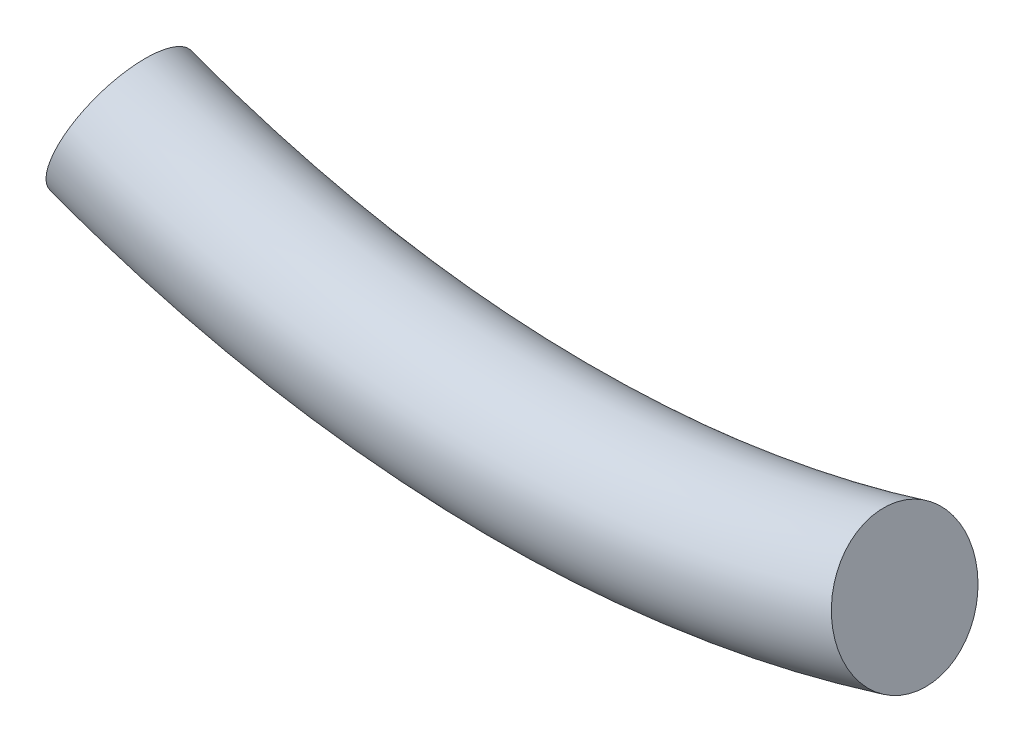
ISO-10303-21;
HEADER;
FILE_DESCRIPTION(('STEP AP214'),'2;1');
FILE_NAME('part.step','',(''),(''),'','','');
FILE_SCHEMA(('AUTOMOTIVE_DESIGN { 1 0 10303 214 1 1 1 1 }'));
ENDSEC;
DATA;
#1=APPLICATION_CONTEXT('core data for automotive mechanical design processes');
#2=APPLICATION_PROTOCOL_DEFINITION('international standard','automotive_design',2000,#1);
#3=PRODUCT_CONTEXT('',#1,'mechanical');
#4=PRODUCT('Part','Part','',(#3));
#5=PRODUCT_RELATED_PRODUCT_CATEGORY('part','',(#4));
#6=PRODUCT_DEFINITION_FORMATION('','',#4);
#7=PRODUCT_DEFINITION_CONTEXT('part definition',#1,'design');
#8=PRODUCT_DEFINITION('design','',#6,#7);
#9=PRODUCT_DEFINITION_SHAPE('','',#8);
#10=(LENGTH_UNIT() NAMED_UNIT(*) SI_UNIT(.MILLI.,.METRE.));
#11=(NAMED_UNIT(*) PLANE_ANGLE_UNIT() SI_UNIT($,.RADIAN.));
#12=(NAMED_UNIT(*) SI_UNIT($,.STERADIAN.) SOLID_ANGLE_UNIT());
#13=UNCERTAINTY_MEASURE_WITH_UNIT(LENGTH_MEASURE(1.E-05),#10,'distance_accuracy_value','');
#14=(GEOMETRIC_REPRESENTATION_CONTEXT(3) GLOBAL_UNCERTAINTY_ASSIGNED_CONTEXT((#13)) GLOBAL_UNIT_ASSIGNED_CONTEXT((#10,
#11,#12)) REPRESENTATION_CONTEXT('',''));
#15=CARTESIAN_POINT('',(0.,0.,0.));
#16=DIRECTION('',(0.,0.,1.));
#17=DIRECTION('',(1.,0.,0.));
#18=AXIS2_PLACEMENT_3D('',#15,#16,#17);
#19=CARTESIAN_POINT('',(0.,0.,-101.5));
#20=DIRECTION('',(-0.953915915523171,-0.300074034384166,0.));
#21=DIRECTION('',(0.300074034384166,-0.953915915523171,0.));
#22=AXIS2_PLACEMENT_3D('',#19,#20,#21);
#23=PLANE('',#22);
#24=CARTESIAN_POINT('',(2.17919039685501,-6.92750509647217,-106.7698));
#25=CARTESIAN_POINT('',(2.17918984301487,-6.92750333585026,-106.74734475844));
#26=CARTESIAN_POINT('',(2.17862090205532,-6.9256947093977,-106.724869142741));
#27=CARTESIAN_POINT('',(2.17635747025083,-6.91849940632381,-106.680517548703));
#28=CARTESIAN_POINT('',(2.17466057047544,-6.91310507186858,-106.658642958289));
#29=CARTESIAN_POINT('',(2.17019177517683,-6.89889906111759,-106.616190381653));
#30=CARTESIAN_POINT('',(2.16742179833214,-6.89009348417653,-106.595610156997));
#31=CARTESIAN_POINT('',(2.16088034121122,-6.86929861576626,-106.556262662778));
#32=CARTESIAN_POINT('',(2.15710744019032,-6.85730480784178,-106.53749801701));
#33=CARTESIAN_POINT('',(2.14867526757211,-6.83049947735242,-106.502372515062));
#34=CARTESIAN_POINT('',(2.14401725331382,-6.8156919517868,-106.486008306697));
#35=CARTESIAN_POINT('',(2.13393632125499,-6.78364532184776,-106.456095115093));
#36=CARTESIAN_POINT('',(2.12851234179326,-6.76640284252216,-106.442550104961));
#37=CARTESIAN_POINT('',(2.11706283042356,-6.73000558761492,-106.418698058126));
#38=CARTESIAN_POINT('',(2.11103773953943,-6.7108522140195,-106.4083886702));
#39=CARTESIAN_POINT('',(2.09855334150362,-6.6711651214441,-106.391286516976));
#40=CARTESIAN_POINT('',(2.09209400883193,-6.65063132133763,-106.384493958563));
#41=CARTESIAN_POINT('',(2.07892501973082,-6.60876795811568,-106.374619387071));
#42=CARTESIAN_POINT('',(2.07221537066865,-6.58743841842019,-106.371537264876));
#43=CARTESIAN_POINT('',(2.05873603454983,-6.54458848213424,-106.369170683823));
#44=CARTESIAN_POINT('',(2.05196634749318,-6.52306808554377,-106.369886224964));
#45=CARTESIAN_POINT('',(2.03855890687865,-6.48044670040835,-106.375094745066));
#46=CARTESIAN_POINT('',(2.03192115720672,-6.45934572421657,-106.379587835118));
#47=CARTESIAN_POINT('',(2.0189666258938,-6.41816410840998,-106.392223649074));
#48=CARTESIAN_POINT('',(2.01264982539734,-6.39808340885488,-106.400366158301));
#49=CARTESIAN_POINT('',(2.00051162170426,-6.35949684566737,-106.420076885485));
#50=CARTESIAN_POINT('',(1.99469058295391,-6.34099214058608,-106.431647596081));
#51=CARTESIAN_POINT('',(1.98372226908321,-6.30612458135462,-106.457865149698));
#52=CARTESIAN_POINT('',(1.97857406345444,-6.28975876917847,-106.472507669844));
#53=CARTESIAN_POINT('',(1.96908103297131,-6.25958104026238,-106.504486025252));
#54=CARTESIAN_POINT('',(1.96473735279823,-6.24577276239007,-106.521825634422));
#55=CARTESIAN_POINT('',(1.95699144790232,-6.22114903253118,-106.558664681642));
#56=CARTESIAN_POINT('',(1.95358789303048,-6.2103293520871,-106.578161012918));
#57=CARTESIAN_POINT('',(1.94780526994693,-6.19194676792184,-106.618813737375));
#58=CARTESIAN_POINT('',(1.94542803921235,-6.18438970542145,-106.63997302846));
#59=CARTESIAN_POINT('',(1.94177869326649,-6.17278867107623,-106.683286509964));
#60=CARTESIAN_POINT('',(1.94050422622284,-6.16873722290864,-106.705438476605));
#61=CARTESIAN_POINT('',(1.93935264029228,-6.16507640583892,-106.741730237853));
#62=CARTESIAN_POINT('',(1.93913082309063,-6.1643712633249,-106.755761137143));
#63=CARTESIAN_POINT('',(1.93913172318781,-6.16437412467554,-106.79225524156));
#64=CARTESIAN_POINT('',(1.93970066414737,-6.1661827511281,-106.814730857259));
#65=CARTESIAN_POINT('',(1.94196409595185,-6.17337805420199,-106.859082451298));
#66=CARTESIAN_POINT('',(1.94366099572725,-6.17877238865722,-106.880957041711));
#67=CARTESIAN_POINT('',(1.94812979102586,-6.19297839940822,-106.923409618347));
#68=CARTESIAN_POINT('',(1.95089976787055,-6.20178397634928,-106.943989843003));
#69=CARTESIAN_POINT('',(1.95744122499147,-6.22257884475956,-106.983337337222));
#70=CARTESIAN_POINT('',(1.96121412601237,-6.23457265268404,-107.00210198299));
#71=CARTESIAN_POINT('',(1.96964629863058,-6.26137798317341,-107.037227484938));
#72=CARTESIAN_POINT('',(1.97430431288887,-6.27618550873902,-107.053591693303));
#73=CARTESIAN_POINT('',(1.9843852449477,-6.30823213867807,-107.083504884907));
#74=CARTESIAN_POINT('',(1.98980922440943,-6.32547461800367,-107.097049895039));
#75=CARTESIAN_POINT('',(2.00125873577914,-6.36187187291091,-107.120901941874));
#76=CARTESIAN_POINT('',(2.00728382666327,-6.38102524650633,-107.1312113298));
#77=CARTESIAN_POINT('',(2.01976822469907,-6.42071233908173,-107.148313483024));
#78=CARTESIAN_POINT('',(2.02622755737077,-6.4412461391882,-107.155106041438));
#79=CARTESIAN_POINT('',(2.03939654647188,-6.48310950241016,-107.164980612929));
#80=CARTESIAN_POINT('',(2.04610619553405,-6.50443904210564,-107.168062735124));
#81=CARTESIAN_POINT('',(2.05958553165287,-6.54728897839159,-107.170429316177));
#82=CARTESIAN_POINT('',(2.06635521870952,-6.56880937498206,-107.169713775036));
#83=CARTESIAN_POINT('',(2.07976265932404,-6.61143076011748,-107.164505254934));
#84=CARTESIAN_POINT('',(2.08640040899597,-6.63253173630926,-107.160012164882));
#85=CARTESIAN_POINT('',(2.0993549403089,-6.67371335211585,-107.147376350926));
#86=CARTESIAN_POINT('',(2.10567174080536,-6.69379405167095,-107.139233841699));
#87=CARTESIAN_POINT('',(2.11780994449844,-6.73238061485846,-107.119523114515));
#88=CARTESIAN_POINT('',(2.12363098324878,-6.75088531993975,-107.107952403919));
#89=CARTESIAN_POINT('',(2.13459929711948,-6.78575287917122,-107.081734850302));
#90=CARTESIAN_POINT('',(2.13974750274825,-6.80211869134737,-107.067092330157));
#91=CARTESIAN_POINT('',(2.14924053323138,-6.83229642026345,-107.035113974748));
#92=CARTESIAN_POINT('',(2.15358421340445,-6.84610469813574,-107.017774365578));
#93=CARTESIAN_POINT('',(2.16133011830037,-6.87072842799463,-106.980935318358));
#94=CARTESIAN_POINT('',(2.16473367317221,-6.88154810843871,-106.961438987082));
#95=CARTESIAN_POINT('',(2.17051629625576,-6.89993069260397,-106.920786262625));
#96=CARTESIAN_POINT('',(2.17289352699034,-6.90748775510436,-106.89962697154));
#97=CARTESIAN_POINT('',(2.17654287293619,-6.91908878944958,-106.856313490036));
#98=CARTESIAN_POINT('',(2.17781733997984,-6.92314023761716,-106.834161523395));
#99=CARTESIAN_POINT('',(2.1789689259104,-6.92680105468688,-106.797869762147));
#100=CARTESIAN_POINT('',(2.17919074311206,-6.92750619720089,-106.783838862857));
#101=CARTESIAN_POINT('',(2.17919039685501,-6.92750509647217,-106.7698));
#102=B_SPLINE_CURVE_WITH_KNOTS('',3,(#24,#25,#26,#27,#28,#29,#30,#31,#32,#33,#34,#35,#36,#37,
#38,#39,#40,#41,#42,#43,#44,#45,#46,#47,#48,#49,#50,#51,#52,#53,#54,#55,#56,#57,#58,#59,#60,#61,
#62,#63,#64,#65,#66,#67,#68,#69,#70,#71,#72,#73,#74,#75,#76,#77,#78,#79,#80,#81,#82,#83,#84,#85,
#86,#87,#88,#89,#90,#91,#92,#93,#94,#95,#96,#97,#98,#99,#100,#101),.UNSPECIFIED.,.T.,.F.,(4,2,2,
2,2,2,2,2,2,2,2,2,2,2,2,2,2,2,2,2,2,2,2,2,2,2,2,2,2,2,2,2,2,2,2,2,2,2,4),(0.,0.067321719094081,
0.13478767805546,0.202133559490903,0.269575356418624,0.336922056232688,0.404363034793475,
0.471754892083666,0.539150713403568,0.606544552708824,0.67393839201408,0.741334213333977,
0.808726070624172,0.876167049184945,0.943513748999013,1.01095554592847,1.07830142736562,
1.14576738632871,1.2130891054245,1.25517818200739,1.32249990110147,1.38996586006286,
1.4573117414983,1.52475353842603,1.5921002382401,1.65954121680087,1.72693307409107,
1.79432889541096,1.86172273471622,1.92911657402148,1.99651239534138,2.06390425263158,
2.13134523119235,2.19869193100641,2.26613372793585,2.33347960937301,2.40094556833612,
2.4682672874319,2.51035636401472),.UNSPECIFIED.);
#103=CARTESIAN_POINT('',(2.17919039685501,-6.92750509647217,-106.7698));
#104=VERTEX_POINT('',#103);
#105=EDGE_CURVE('E19',#104,#104,#102,.T.);
#106=ORIENTED_EDGE('',*,*,#105,.F.);
#107=EDGE_LOOP('',(#106));
#108=FACE_BOUND('',#107,.T.);
#109=ADVANCED_FACE('F15',(#108),#23,.F.);
#110=CARTESIAN_POINT('',(0.,0.,-101.5));
#111=DIRECTION('',(-0.936440022184738,0.350827713914747,0.));
#112=DIRECTION('',(-0.350827713914747,-0.936440022184738,0.));
#113=AXIS2_PLACEMENT_3D('',#110,#111,#112);
#114=PLANE('',#113);
#115=CARTESIAN_POINT('',(-2.26711037001004,-6.05144006868093,-106.7698));
#116=CARTESIAN_POINT('',(-2.26711101752514,-6.05144179704795,-106.74734475844));
#117=CARTESIAN_POINT('',(-2.26777618756094,-6.05321728917236,-106.724869142741));
#118=CARTESIAN_POINT('',(-2.27042244986484,-6.0602807731341,-106.680517548703));
#119=CARTESIAN_POINT('',(-2.27240635850314,-6.06557628251257,-106.658642958289));
#120=CARTESIAN_POINT('',(-2.27763099328962,-6.07952203685667,-106.616190381653));
#121=CARTESIAN_POINT('',(-2.28086947623938,-6.08816629420875,-106.595610156997));
#122=CARTESIAN_POINT('',(-2.28851733704851,-6.10858019727773,-106.556262662778));
#123=CARTESIAN_POINT('',(-2.29292837595331,-6.1203542767077,-106.53749801701));
#124=CARTESIAN_POINT('',(-2.30278674256957,-6.14666852922163,-106.502372515062));
#125=CARTESIAN_POINT('',(-2.30823260027923,-6.16120477853198,-106.486008306697));
#126=CARTESIAN_POINT('',(-2.32001859287798,-6.1926643090448,-106.456095115093));
#127=CARTESIAN_POINT('',(-2.32635996899466,-6.20959090336977,-106.442550104961));
#128=CARTESIAN_POINT('',(-2.33974601856579,-6.24532135470006,-106.418698058126));
#129=CARTESIAN_POINT('',(-2.34679017640286,-6.26412383540379,-106.4083886702));
#130=CARTESIAN_POINT('',(-2.36138615046469,-6.30308385404587,-106.391286516976));
#131=CARTESIAN_POINT('',(-2.36893799652587,-6.32324147162445,-106.384493958563));
#132=CARTESIAN_POINT('',(-2.38433435146338,-6.36433789128404,-106.374619387071));
#133=CARTESIAN_POINT('',(-2.3921788517264,-6.38527667037409,-106.371537264876));
#134=CARTESIAN_POINT('',(-2.40793804490471,-6.42734158892011,-106.369170683823));
#135=CARTESIAN_POINT('',(-2.41585273782,-6.44846772837607,-106.369886224964));
#136=CARTESIAN_POINT('',(-2.43152787529031,-6.49030828286547,-106.375094745066));
#137=CARTESIAN_POINT('',(-2.43928831530212,-6.51102268577206,-106.379587835118));
#138=CARTESIAN_POINT('',(-2.45443393966339,-6.55144984773882,-106.392223649074));
#139=CARTESIAN_POINT('',(-2.46181914605745,-6.57116266564117,-106.400366158301));
#140=CARTESIAN_POINT('',(-2.4760103714376,-6.60904231677114,-106.420076885485));
#141=CARTESIAN_POINT('',(-2.48281596433598,-6.62720801267249,-106.431647596081));
#142=CARTESIAN_POINT('',(-2.49563942801438,-6.66143679259837,-106.457865149698));
#143=CARTESIAN_POINT('',(-2.5016583866864,-6.67750278045737,-106.472507669844));
#144=CARTESIAN_POINT('',(-2.51275704168784,-6.70712764851523,-106.504486025252));
#145=CARTESIAN_POINT('',(-2.5178353997278,-6.72068295651109,-106.521825634422));
#146=CARTESIAN_POINT('',(-2.52689142522634,-6.74485557566976,-106.558664681642));
#147=CARTESIAN_POINT('',(-2.5308706478116,-6.75547703782403,-106.578161012918));
#148=CARTESIAN_POINT('',(-2.53763132752518,-6.77352285008421,-106.618813737375));
#149=CARTESIAN_POINT('',(-2.54041063639065,-6.78094146598144,-106.63997302846));
#150=CARTESIAN_POINT('',(-2.54467722246197,-6.79232996750743,-106.683286509964));
#151=CARTESIAN_POINT('',(-2.54616724928252,-6.79630719249152,-106.705438476605));
#152=CARTESIAN_POINT('',(-2.54751361122358,-6.79990094280242,-106.741730237853));
#153=CARTESIAN_POINT('',(-2.54777294596383,-6.80059316699192,-106.755761137143));
#154=CARTESIAN_POINT('',(-2.54777189362674,-6.80059035806168,-106.79225524156));
#155=CARTESIAN_POINT('',(-2.54710672359094,-6.79881486593727,-106.814730857259));
#156=CARTESIAN_POINT('',(-2.54446046128704,-6.79175138197554,-106.859082451298));
#157=CARTESIAN_POINT('',(-2.54247655264874,-6.78645587259706,-106.880957041711));
#158=CARTESIAN_POINT('',(-2.53725191786226,-6.77251011825296,-106.923409618347));
#159=CARTESIAN_POINT('',(-2.53401343491249,-6.76386586090087,-106.943989843003));
#160=CARTESIAN_POINT('',(-2.52636557410336,-6.74345195783189,-106.983337337222));
#161=CARTESIAN_POINT('',(-2.52195453519856,-6.73167787840192,-107.00210198299));
#162=CARTESIAN_POINT('',(-2.5120961685823,-6.70536362588799,-107.037227484938));
#163=CARTESIAN_POINT('',(-2.50665031087265,-6.69082737657763,-107.053591693303));
#164=CARTESIAN_POINT('',(-2.49486431827389,-6.65936784606481,-107.083504884907));
#165=CARTESIAN_POINT('',(-2.48852294215721,-6.64244125173985,-107.097049895039));
#166=CARTESIAN_POINT('',(-2.47513689258609,-6.60671080040955,-107.120901941874));
#167=CARTESIAN_POINT('',(-2.46809273474902,-6.58790831970582,-107.1312113298));
#168=CARTESIAN_POINT('',(-2.45349676068718,-6.54894830106374,-107.148313483024));
#169=CARTESIAN_POINT('',(-2.445944914626,-6.52879068348516,-107.155106041438));
#170=CARTESIAN_POINT('',(-2.43054855968849,-6.48769426382558,-107.164980612929));
#171=CARTESIAN_POINT('',(-2.42270405942547,-6.46675548473553,-107.168062735124));
#172=CARTESIAN_POINT('',(-2.40694486624716,-6.42469056618951,-107.170429316177));
#173=CARTESIAN_POINT('',(-2.39903017333187,-6.40356442673354,-107.169713775036));
#174=CARTESIAN_POINT('',(-2.38335503586156,-6.36172387224414,-107.164505254934));
#175=CARTESIAN_POINT('',(-2.37559459584975,-6.34100946933756,-107.160012164882));
#176=CARTESIAN_POINT('',(-2.36044897148849,-6.30058230737079,-107.147376350926));
#177=CARTESIAN_POINT('',(-2.35306376509442,-6.28086948946844,-107.139233841699));
#178=CARTESIAN_POINT('',(-2.33887253971427,-6.24298983833848,-107.119523114515));
#179=CARTESIAN_POINT('',(-2.33206694681589,-6.22482414243713,-107.107952403919));
#180=CARTESIAN_POINT('',(-2.31924348313749,-6.19059536251124,-107.081734850302));
#181=CARTESIAN_POINT('',(-2.31322452446547,-6.17452937465224,-107.067092330157));
#182=CARTESIAN_POINT('',(-2.30212586946404,-6.14490450659439,-107.035113974748));
#183=CARTESIAN_POINT('',(-2.29704751142408,-6.13134919859853,-107.017774365578));
#184=CARTESIAN_POINT('',(-2.28799148592553,-6.10717657943987,-106.980935318358));
#185=CARTESIAN_POINT('',(-2.28401226334028,-6.0965551172856,-106.961438987082));
#186=CARTESIAN_POINT('',(-2.27725158362669,-6.07850930502542,-106.920786262625));
#187=CARTESIAN_POINT('',(-2.27447227476123,-6.0710906891282,-106.89962697154));
#188=CARTESIAN_POINT('',(-2.27020568868991,-6.0597021876022,-106.856313490036));
#189=CARTESIAN_POINT('',(-2.26871566186936,-6.05572496261812,-106.834161523395));
#190=CARTESIAN_POINT('',(-2.2673692999283,-6.05213121230722,-106.797869762147));
#191=CARTESIAN_POINT('',(-2.26710996518805,-6.05143898811773,-106.783838862858));
#192=CARTESIAN_POINT('',(-2.26711037001004,-6.05144006868093,-106.7698));
#193=B_SPLINE_CURVE_WITH_KNOTS('',3,(#115,#116,#117,#118,#119,#120,#121,#122,#123,#124,#125,
#126,#127,#128,#129,#130,#131,#132,#133,#134,#135,#136,#137,#138,#139,#140,#141,#142,#143,#144,
#145,#146,#147,#148,#149,#150,#151,#152,#153,#154,#155,#156,#157,#158,#159,#160,#161,#162,#163,
#164,#165,#166,#167,#168,#169,#170,#171,#172,#173,#174,#175,#176,#177,#178,#179,#180,#181,#182,
#183,#184,#185,#186,#187,#188,#189,#190,#191,#192),.UNSPECIFIED.,.T.,.F.,(4,2,2,2,2,2,2,2,2,2,2,
2,2,2,2,2,2,2,2,2,2,2,2,2,2,2,2,2,2,2,2,2,2,2,2,2,2,2,4),(0.,0.0673217190940811,
0.13478767805546,0.202133559490903,0.269575356418624,0.336922056232689,0.404363034793475,
0.471754892083669,0.53915071340357,0.606544552708824,0.673938392014081,0.741334213333979,
0.808726070624174,0.876167049184948,0.943513748999015,1.01095554592846,1.07830142736562,
1.14576738632871,1.2130891054245,1.25517818200739,1.32249990110147,1.38996586006285,
1.45731174149828,1.52475353842602,1.59210023824009,1.65954121680086,1.72693307409105,
1.79432889541095,1.86172273471621,1.92911657402146,1.99651239534136,2.06390425263156,
2.13134523119234,2.19869193100639,2.26613372793584,2.33347960937299,2.40094556833609,
2.46826728743187,2.51035636401472),.UNSPECIFIED.);
#194=CARTESIAN_POINT('',(-2.26711037001004,-6.05144006868093,-106.7698));
#195=VERTEX_POINT('',#194);
#196=EDGE_CURVE('E10',#195,#195,#193,.T.);
#197=ORIENTED_EDGE('',*,*,#196,.F.);
#198=EDGE_LOOP('',(#197));
#199=FACE_BOUND('',#198,.T.);
#200=ADVANCED_FACE('F37',(#199),#114,.T.);
#201=CARTESIAN_POINT('',(0.,0.,-106.7698));
#202=DIRECTION('',(0.,0.,-1.));
#203=DIRECTION('',(-0.936440022184738,0.350827713914747,0.));
#204=AXIS2_PLACEMENT_3D('',#201,#202,#203);
#205=TOROIDAL_SURFACE('',#204,6.86217582046821,0.4);
#206=ORIENTED_EDGE('',*,*,#105,.T.);
#207=EDGE_LOOP('',(#206));
#208=FACE_BOUND('',#207,.T.);
#209=ORIENTED_EDGE('',*,*,#196,.T.);
#210=EDGE_LOOP('',(#209));
#211=FACE_BOUND('',#210,.T.);
#212=ADVANCED_FACE('F35',(#208,#211),#205,.T.);
#213=CLOSED_SHELL('',(#109,#200,#212));
#214=MANIFOLD_SOLID_BREP('B1',#213);
#215=ADVANCED_BREP_SHAPE_REPRESENTATION('',(#18,#214),#14);
#216=SHAPE_DEFINITION_REPRESENTATION(#9,#215);
ENDSEC;
END-ISO-10303-21;
